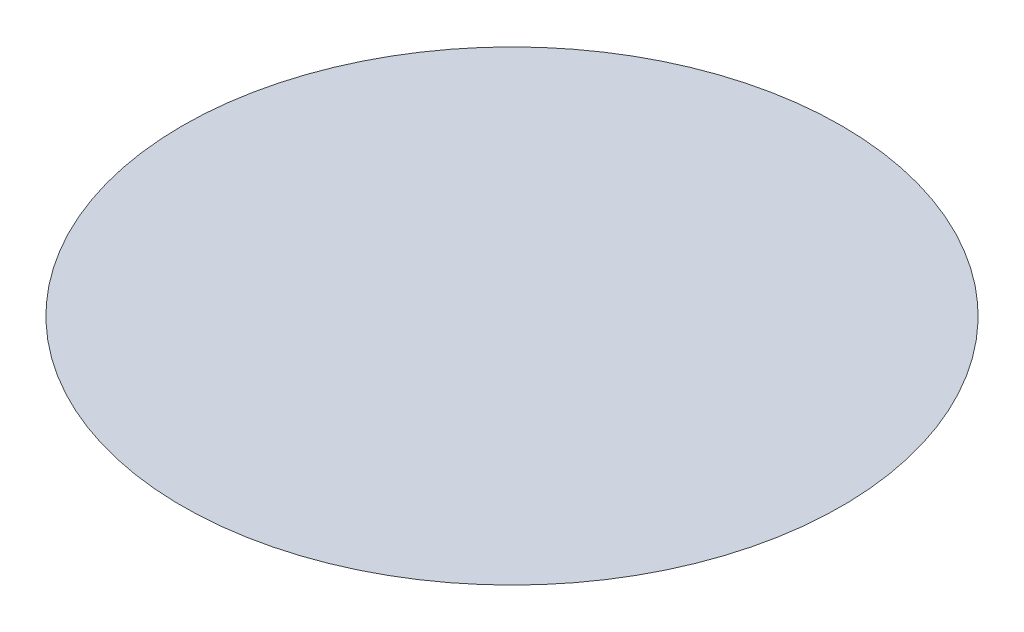
ISO-10303-21;
HEADER;
FILE_DESCRIPTION(('STEP AP214'),'2;1');
FILE_NAME('part.step','',(''),(''),'','','');
FILE_SCHEMA(('AUTOMOTIVE_DESIGN { 1 0 10303 214 1 1 1 1 }'));
ENDSEC;
DATA;
#1=APPLICATION_CONTEXT('core data for automotive mechanical design processes');
#2=APPLICATION_PROTOCOL_DEFINITION('international standard','automotive_design',2000,#1);
#3=PRODUCT_CONTEXT('',#1,'mechanical');
#4=PRODUCT('Part','Part','',(#3));
#5=PRODUCT_RELATED_PRODUCT_CATEGORY('part','',(#4));
#6=PRODUCT_DEFINITION_FORMATION('','',#4);
#7=PRODUCT_DEFINITION_CONTEXT('part definition',#1,'design');
#8=PRODUCT_DEFINITION('design','',#6,#7);
#9=PRODUCT_DEFINITION_SHAPE('','',#8);
#10=(LENGTH_UNIT() NAMED_UNIT(*) SI_UNIT(.MILLI.,.METRE.));
#11=(NAMED_UNIT(*) PLANE_ANGLE_UNIT() SI_UNIT($,.RADIAN.));
#12=(NAMED_UNIT(*) SI_UNIT($,.STERADIAN.) SOLID_ANGLE_UNIT());
#13=UNCERTAINTY_MEASURE_WITH_UNIT(LENGTH_MEASURE(1.E-05),#10,'distance_accuracy_value','');
#14=(GEOMETRIC_REPRESENTATION_CONTEXT(3) GLOBAL_UNCERTAINTY_ASSIGNED_CONTEXT((#13)) GLOBAL_UNIT_ASSIGNED_CONTEXT((#10,
#11,#12)) REPRESENTATION_CONTEXT('',''));
#15=CARTESIAN_POINT('',(0.,0.,0.));
#16=DIRECTION('',(0.,0.,1.));
#17=DIRECTION('',(1.,0.,0.));
#18=AXIS2_PLACEMENT_3D('',#15,#16,#17);
#19=CARTESIAN_POINT('',(0.,200.025,0.));
#20=DIRECTION('',(0.,-1.,0.));
#21=DIRECTION('',(-1.,0.,0.));
#22=AXIS2_PLACEMENT_3D('',#19,#20,#21);
#23=SPHERICAL_SURFACE('',#22,200.025);
#24=CARTESIAN_POINT('',(0.,32.,0.));
#25=DIRECTION('',(0.,-1.,0.));
#26=DIRECTION('',(0.,0.,-1.));
#27=AXIS2_PLACEMENT_3D('',#24,#25,#26);
#28=CIRCLE('',#27,108.524651577418);
#29=CARTESIAN_POINT('',(0.,32.,-108.524651577418));
#30=VERTEX_POINT('',#29);
#31=EDGE_CURVE('E10',#30,#30,#28,.T.);
#32=ORIENTED_EDGE('',*,*,#31,.T.);
#33=EDGE_LOOP('',(#32));
#34=FACE_BOUND('',#33,.T.);
#35=ADVANCED_FACE('F33',(#34),#23,.T.);
#36=CARTESIAN_POINT('',(0.,32.,0.));
#37=DIRECTION('',(0.,1.,0.));
#38=DIRECTION('',(0.,0.,1.));
#39=AXIS2_PLACEMENT_3D('',#36,#37,#38);
#40=PLANE('',#39);
#41=ORIENTED_EDGE('',*,*,#31,.F.);
#42=EDGE_LOOP('',(#41));
#43=FACE_BOUND('',#42,.T.);
#44=ADVANCED_FACE('F41',(#43),#40,.T.);
#45=CLOSED_SHELL('',(#35,#44));
#46=MANIFOLD_SOLID_BREP('B2',#45);
#47=ADVANCED_BREP_SHAPE_REPRESENTATION('',(#18,#46),#14);
#48=SHAPE_DEFINITION_REPRESENTATION(#9,#47);
ENDSEC;
END-ISO-10303-21;
